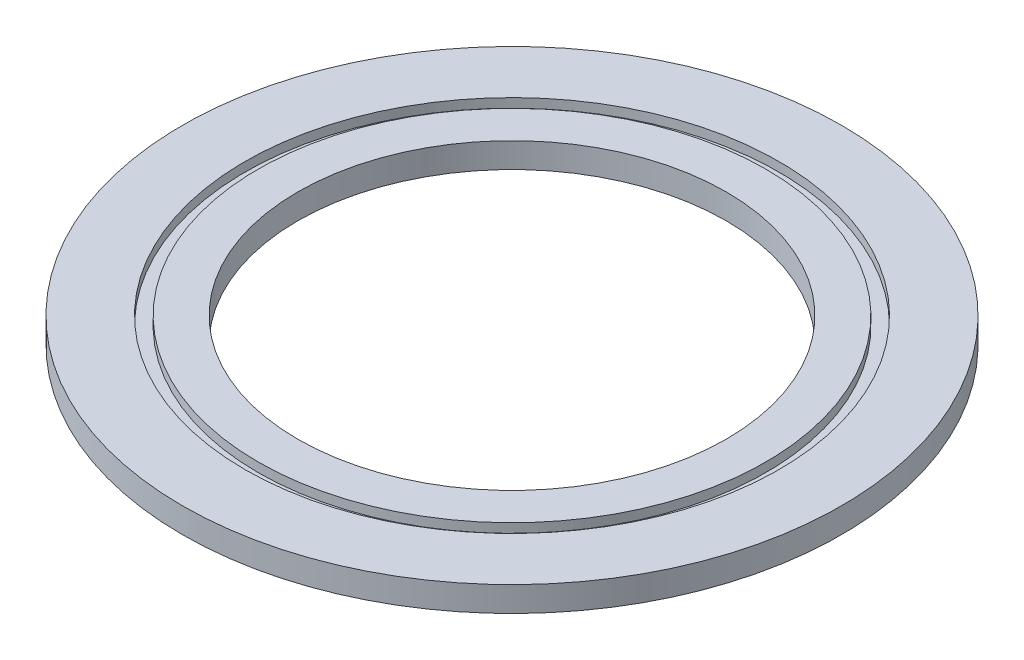
ISO-10303-21;
HEADER;
FILE_DESCRIPTION(('STEP AP214'),'2;1');
FILE_NAME('part.step','',(''),(''),'','','');
FILE_SCHEMA(('AUTOMOTIVE_DESIGN { 1 0 10303 214 1 1 1 1 }'));
ENDSEC;
DATA;
#1=APPLICATION_CONTEXT('core data for automotive mechanical design processes');
#2=APPLICATION_PROTOCOL_DEFINITION('international standard','automotive_design',2000,#1);
#3=PRODUCT_CONTEXT('',#1,'mechanical');
#4=PRODUCT('Part','Part','',(#3));
#5=PRODUCT_RELATED_PRODUCT_CATEGORY('part','',(#4));
#6=PRODUCT_DEFINITION_FORMATION('','',#4);
#7=PRODUCT_DEFINITION_CONTEXT('part definition',#1,'design');
#8=PRODUCT_DEFINITION('design','',#6,#7);
#9=PRODUCT_DEFINITION_SHAPE('','',#8);
#10=(LENGTH_UNIT() NAMED_UNIT(*) SI_UNIT(.MILLI.,.METRE.));
#11=(NAMED_UNIT(*) PLANE_ANGLE_UNIT() SI_UNIT($,.RADIAN.));
#12=(NAMED_UNIT(*) SI_UNIT($,.STERADIAN.) SOLID_ANGLE_UNIT());
#13=UNCERTAINTY_MEASURE_WITH_UNIT(LENGTH_MEASURE(1.E-05),#10,'distance_accuracy_value','');
#14=(GEOMETRIC_REPRESENTATION_CONTEXT(3) GLOBAL_UNCERTAINTY_ASSIGNED_CONTEXT((#13)) GLOBAL_UNIT_ASSIGNED_CONTEXT((#10,
#11,#12)) REPRESENTATION_CONTEXT('',''));
#15=CARTESIAN_POINT('',(0.,0.,0.));
#16=DIRECTION('',(0.,0.,1.));
#17=DIRECTION('',(1.,0.,0.));
#18=AXIS2_PLACEMENT_3D('',#15,#16,#17);
#19=CARTESIAN_POINT('',(0.,9.5,0.));
#20=DIRECTION('',(0.,1.,0.));
#21=DIRECTION('',(0.,0.,1.));
#22=AXIS2_PLACEMENT_3D('',#19,#20,#21);
#23=PLANE('',#22);
#24=CARTESIAN_POINT('',(0.,9.5,0.));
#25=DIRECTION('',(0.,1.,0.));
#26=DIRECTION('',(0.,0.,1.));
#27=AXIS2_PLACEMENT_3D('',#24,#25,#26);
#28=CIRCLE('',#27,162.5);
#29=CARTESIAN_POINT('',(0.,9.5,162.5));
#30=VERTEX_POINT('',#29);
#31=EDGE_CURVE('E45',#30,#30,#28,.T.);
#32=ORIENTED_EDGE('',*,*,#31,.F.);
#33=EDGE_LOOP('',(#32));
#34=FACE_BOUND('',#33,.T.);
#35=CARTESIAN_POINT('',(0.,9.5,0.));
#36=DIRECTION('',(0.,1.,0.));
#37=DIRECTION('',(0.,0.,1.));
#38=AXIS2_PLACEMENT_3D('',#35,#36,#37);
#39=CIRCLE('',#38,192.5);
#40=CARTESIAN_POINT('',(0.,9.5,192.5));
#41=VERTEX_POINT('',#40);
#42=EDGE_CURVE('E59',#41,#41,#39,.T.);
#43=ORIENTED_EDGE('',*,*,#42,.T.);
#44=EDGE_LOOP('',(#43));
#45=FACE_BOUND('',#44,.T.);
#46=ADVANCED_FACE('F34',(#34,#45),#23,.T.);
#47=CARTESIAN_POINT('',(0.,9.5,0.));
#48=DIRECTION('',(0.,1.,0.));
#49=DIRECTION('',(0.,0.,1.));
#50=AXIS2_PLACEMENT_3D('',#47,#48,#49);
#51=CIRCLE('',#50,202.5);
#52=CARTESIAN_POINT('',(0.,9.5,202.5));
#53=VERTEX_POINT('',#52);
#54=EDGE_CURVE('E53',#53,#53,#51,.T.);
#55=ORIENTED_EDGE('',*,*,#54,.F.);
#56=EDGE_LOOP('',(#55));
#57=FACE_BOUND('',#56,.T.);
#58=CARTESIAN_POINT('',(0.,9.5,0.));
#59=DIRECTION('',(0.,1.,0.));
#60=DIRECTION('',(0.,0.,1.));
#61=AXIS2_PLACEMENT_3D('',#58,#59,#60);
#62=CIRCLE('',#61,250.);
#63=CARTESIAN_POINT('',(0.,9.5,250.));
#64=VERTEX_POINT('',#63);
#65=EDGE_CURVE('E10',#64,#64,#62,.T.);
#66=ORIENTED_EDGE('',*,*,#65,.T.);
#67=EDGE_LOOP('',(#66));
#68=FACE_BOUND('',#67,.T.);
#69=ADVANCED_FACE('F81',(#57,#68),#23,.T.);
#70=CARTESIAN_POINT('',(0.,-9.5,0.));
#71=DIRECTION('',(0.,1.,0.));
#72=DIRECTION('',(0.,0.,1.));
#73=AXIS2_PLACEMENT_3D('',#70,#71,#72);
#74=PLANE('',#73);
#75=CARTESIAN_POINT('',(0.,-9.5,0.));
#76=DIRECTION('',(0.,1.,0.));
#77=DIRECTION('',(0.,0.,1.));
#78=AXIS2_PLACEMENT_3D('',#75,#76,#77);
#79=CIRCLE('',#78,250.);
#80=CARTESIAN_POINT('',(0.,-9.5,250.));
#81=VERTEX_POINT('',#80);
#82=EDGE_CURVE('E38',#81,#81,#79,.T.);
#83=ORIENTED_EDGE('',*,*,#82,.F.);
#84=EDGE_LOOP('',(#83));
#85=FACE_BOUND('',#84,.T.);
#86=CARTESIAN_POINT('',(0.,-9.5,0.));
#87=DIRECTION('',(0.,1.,0.));
#88=DIRECTION('',(0.,0.,1.));
#89=AXIS2_PLACEMENT_3D('',#86,#87,#88);
#90=CIRCLE('',#89,162.5);
#91=CARTESIAN_POINT('',(0.,-9.5,162.5));
#92=VERTEX_POINT('',#91);
#93=EDGE_CURVE('E47',#92,#92,#90,.T.);
#94=ORIENTED_EDGE('',*,*,#93,.T.);
#95=EDGE_LOOP('',(#94));
#96=FACE_BOUND('',#95,.T.);
#97=ADVANCED_FACE('F83',(#85,#96),#74,.F.);
#98=CARTESIAN_POINT('',(0.,9.5,0.));
#99=DIRECTION('',(0.,-1.,0.));
#100=DIRECTION('',(0.,0.,-1.));
#101=AXIS2_PLACEMENT_3D('',#98,#99,#100);
#102=CYLINDRICAL_SURFACE('',#101,250.);
#103=ORIENTED_EDGE('',*,*,#65,.F.);
#104=EDGE_LOOP('',(#103));
#105=FACE_BOUND('',#104,.T.);
#106=ORIENTED_EDGE('',*,*,#82,.T.);
#107=EDGE_LOOP('',(#106));
#108=FACE_BOUND('',#107,.T.);
#109=ADVANCED_FACE('F36',(#105,#108),#102,.T.);
#110=CARTESIAN_POINT('',(0.,9.5,0.));
#111=DIRECTION('',(0.,-1.,0.));
#112=DIRECTION('',(0.,0.,-1.));
#113=AXIS2_PLACEMENT_3D('',#110,#111,#112);
#114=CYLINDRICAL_SURFACE('',#113,162.5);
#115=ORIENTED_EDGE('',*,*,#31,.T.);
#116=EDGE_LOOP('',(#115));
#117=FACE_BOUND('',#116,.T.);
#118=ORIENTED_EDGE('',*,*,#93,.F.);
#119=EDGE_LOOP('',(#118));
#120=FACE_BOUND('',#119,.T.);
#121=ADVANCED_FACE('F77',(#117,#120),#114,.F.);
#122=CARTESIAN_POINT('',(0.,2.5,0.));
#123=DIRECTION('',(0.,1.,0.));
#124=DIRECTION('',(0.,0.,1.));
#125=AXIS2_PLACEMENT_3D('',#122,#123,#124);
#126=CYLINDRICAL_SURFACE('',#125,202.5);
#127=CARTESIAN_POINT('',(0.,2.5,0.));
#128=DIRECTION('',(0.,1.,0.));
#129=DIRECTION('',(0.,0.,1.));
#130=AXIS2_PLACEMENT_3D('',#127,#128,#129);
#131=CIRCLE('',#130,202.5);
#132=CARTESIAN_POINT('',(0.,2.5,202.5));
#133=VERTEX_POINT('',#132);
#134=EDGE_CURVE('E50',#133,#133,#131,.T.);
#135=ORIENTED_EDGE('',*,*,#134,.F.);
#136=EDGE_LOOP('',(#135));
#137=FACE_BOUND('',#136,.T.);
#138=ORIENTED_EDGE('',*,*,#54,.T.);
#139=EDGE_LOOP('',(#138));
#140=FACE_BOUND('',#139,.T.);
#141=ADVANCED_FACE('F71',(#137,#140),#126,.F.);
#142=CARTESIAN_POINT('',(0.,2.5,0.));
#143=DIRECTION('',(0.,1.,0.));
#144=DIRECTION('',(0.,0.,1.));
#145=AXIS2_PLACEMENT_3D('',#142,#143,#144);
#146=PLANE('',#145);
#147=CARTESIAN_POINT('',(0.,2.5,0.));
#148=DIRECTION('',(0.,1.,0.));
#149=DIRECTION('',(0.,0.,1.));
#150=AXIS2_PLACEMENT_3D('',#147,#148,#149);
#151=CIRCLE('',#150,192.5);
#152=CARTESIAN_POINT('',(0.,2.5,192.5));
#153=VERTEX_POINT('',#152);
#154=EDGE_CURVE('E56',#153,#153,#151,.T.);
#155=ORIENTED_EDGE('',*,*,#154,.F.);
#156=EDGE_LOOP('',(#155));
#157=FACE_BOUND('',#156,.T.);
#158=ORIENTED_EDGE('',*,*,#134,.T.);
#159=EDGE_LOOP('',(#158));
#160=FACE_BOUND('',#159,.T.);
#161=ADVANCED_FACE('F68',(#157,#160),#146,.T.);
#162=CARTESIAN_POINT('',(0.,2.5,0.));
#163=DIRECTION('',(0.,1.,0.));
#164=DIRECTION('',(0.,0.,1.));
#165=AXIS2_PLACEMENT_3D('',#162,#163,#164);
#166=CYLINDRICAL_SURFACE('',#165,192.5);
#167=ORIENTED_EDGE('',*,*,#154,.T.);
#168=EDGE_LOOP('',(#167));
#169=FACE_BOUND('',#168,.T.);
#170=ORIENTED_EDGE('',*,*,#42,.F.);
#171=EDGE_LOOP('',(#170));
#172=FACE_BOUND('',#171,.T.);
#173=ADVANCED_FACE('F65',(#169,#172),#166,.T.);
#174=CLOSED_SHELL('',(#46,#69,#97,#109,#121,#141,#161,#173));
#175=MANIFOLD_SOLID_BREP('B2',#174);
#176=ADVANCED_BREP_SHAPE_REPRESENTATION('',(#18,#175),#14);
#177=SHAPE_DEFINITION_REPRESENTATION(#9,#176);
ENDSEC;
END-ISO-10303-21;
